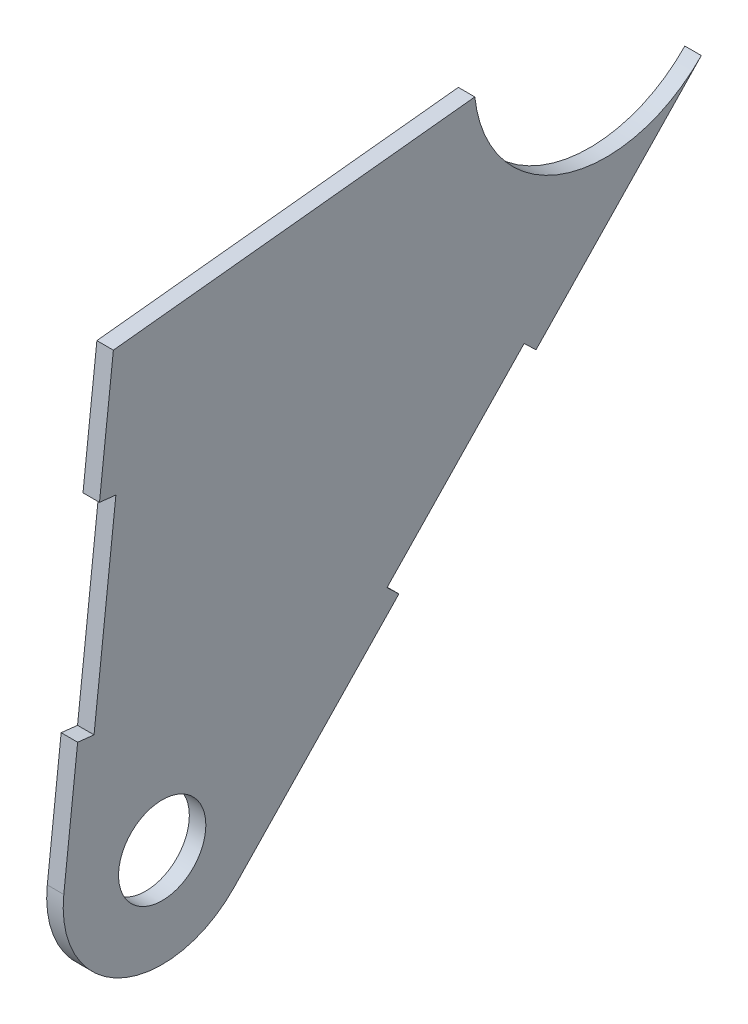
ISO-10303-21;
HEADER;
FILE_DESCRIPTION(('STEP AP214'),'2;1');
FILE_NAME('part.step','',(''),(''),'','','');
FILE_SCHEMA(('AUTOMOTIVE_DESIGN { 1 0 10303 214 1 1 1 1 }'));
ENDSEC;
DATA;
#1=APPLICATION_CONTEXT('core data for automotive mechanical design processes');
#2=APPLICATION_PROTOCOL_DEFINITION('international standard','automotive_design',2000,#1);
#3=PRODUCT_CONTEXT('',#1,'mechanical');
#4=PRODUCT('Part','Part','',(#3));
#5=PRODUCT_RELATED_PRODUCT_CATEGORY('part','',(#4));
#6=PRODUCT_DEFINITION_FORMATION('','',#4);
#7=PRODUCT_DEFINITION_CONTEXT('part definition',#1,'design');
#8=PRODUCT_DEFINITION('design','',#6,#7);
#9=PRODUCT_DEFINITION_SHAPE('','',#8);
#10=(LENGTH_UNIT() NAMED_UNIT(*) SI_UNIT(.MILLI.,.METRE.));
#11=(NAMED_UNIT(*) PLANE_ANGLE_UNIT() SI_UNIT($,.RADIAN.));
#12=(NAMED_UNIT(*) SI_UNIT($,.STERADIAN.) SOLID_ANGLE_UNIT());
#13=UNCERTAINTY_MEASURE_WITH_UNIT(LENGTH_MEASURE(1.E-05),#10,'distance_accuracy_value','');
#14=(GEOMETRIC_REPRESENTATION_CONTEXT(3) GLOBAL_UNCERTAINTY_ASSIGNED_CONTEXT((#13)) GLOBAL_UNIT_ASSIGNED_CONTEXT((#10,
#11,#12)) REPRESENTATION_CONTEXT('',''));
#15=CARTESIAN_POINT('',(0.,0.,0.));
#16=DIRECTION('',(0.,0.,1.));
#17=DIRECTION('',(1.,0.,0.));
#18=AXIS2_PLACEMENT_3D('',#15,#16,#17);
#19=CARTESIAN_POINT('',(1.5875,-6.59599350707376,-6.87157148363026));
#20=DIRECTION('',(0.,-0.692492756648165,-0.721424827677718));
#21=DIRECTION('',(0.,0.721424827677718,-0.692492756648165));
#22=AXIS2_PLACEMENT_3D('',#19,#20,#21);
#23=PLANE('',#22);
#24=DIRECTION('',(0.,-0.721424827677718,0.692492756648165));
#25=VECTOR('',#24,1.);
#26=CARTESIAN_POINT('',(0.,-6.59599350707376,-6.87157148363026));
#27=LINE('',#26,#25);
#28=CARTESIAN_POINT('',(0.,40.2816904225398,-51.8692695448362));
#29=VERTEX_POINT('',#28);
#30=CARTESIAN_POINT('',(0.,23.7144199413633,-35.966414021307));
#31=VERTEX_POINT('',#30);
#32=EDGE_CURVE('E195',#29,#31,#27,.T.);
#33=ORIENTED_EDGE('',*,*,#32,.F.);
#34=DIRECTION('',(-1.,0.,0.));
#35=VECTOR('',#34,1.);
#36=CARTESIAN_POINT('',(1.5875,40.2816904225398,-51.8692695448362));
#37=LINE('',#36,#35);
#38=CARTESIAN_POINT('',(1.5875,40.2816904225398,-51.8692695448362));
#39=VERTEX_POINT('',#38);
#40=EDGE_CURVE('E11',#39,#29,#37,.T.);
#41=ORIENTED_EDGE('',*,*,#40,.F.);
#42=DIRECTION('',(0.,-0.721424827677718,0.692492756648165));
#43=VECTOR('',#42,1.);
#44=CARTESIAN_POINT('',(1.5875,-6.59599350707376,-6.87157148363026));
#45=LINE('',#44,#43);
#46=CARTESIAN_POINT('',(1.5875,23.7144199413633,-35.966414021307));
#47=VERTEX_POINT('',#46);
#48=EDGE_CURVE('E243',#39,#47,#45,.T.);
#49=ORIENTED_EDGE('',*,*,#48,.T.);
#50=DIRECTION('',(-1.,0.,0.));
#51=VECTOR('',#50,1.);
#52=CARTESIAN_POINT('',(1.5875,23.7144199413633,-35.966414021307));
#53=LINE('',#52,#51);
#54=EDGE_CURVE('E60',#47,#31,#53,.T.);
#55=ORIENTED_EDGE('',*,*,#54,.T.);
#56=EDGE_LOOP('',(#33,#41,#49,#55));
#57=FACE_BOUND('',#56,.T.);
#58=ADVANCED_FACE('F40',(#57),#23,.T.);
#59=CARTESIAN_POINT('',(1.5875,49.0763484319715,-42.7071742333292));
#60=DIRECTION('',(-1.,0.,0.));
#61=DIRECTION('',(0.,0.,1.));
#62=AXIS2_PLACEMENT_3D('',#59,#60,#61);
#63=CYLINDRICAL_SURFACE('',#62,12.7);
#64=CARTESIAN_POINT('',(0.,49.0763484319715,-42.7071742333292));
#65=DIRECTION('',(1.,0.,0.));
#66=DIRECTION('',(0.,0.,-1.));
#67=AXIS2_PLACEMENT_3D('',#64,#65,#66);
#68=CIRCLE('',#67,12.7);
#69=CARTESIAN_POINT('',(0.,47.7288501739447,-30.0788628480087));
#70=VERTEX_POINT('',#69);
#71=EDGE_CURVE('E198',#29,#70,#68,.F.);
#72=ORIENTED_EDGE('',*,*,#71,.T.);
#73=DIRECTION('',(-1.,0.,0.));
#74=VECTOR('',#73,1.);
#75=CARTESIAN_POINT('',(1.5875,47.7288501739447,-30.0788628480087));
#76=LINE('',#75,#74);
#77=CARTESIAN_POINT('',(1.5875,47.7288501739447,-30.0788628480087));
#78=VERTEX_POINT('',#77);
#79=EDGE_CURVE('E49',#78,#70,#76,.T.);
#80=ORIENTED_EDGE('',*,*,#79,.F.);
#81=CARTESIAN_POINT('',(1.5875,49.0763484319715,-42.7071742333292));
#82=DIRECTION('',(1.,0.,0.));
#83=DIRECTION('',(0.,0.,-1.));
#84=AXIS2_PLACEMENT_3D('',#81,#82,#83);
#85=CIRCLE('',#84,12.7);
#86=EDGE_CURVE('E292',#39,#78,#85,.F.);
#87=ORIENTED_EDGE('',*,*,#86,.F.);
#88=ORIENTED_EDGE('',*,*,#40,.T.);
#89=EDGE_LOOP('',(#72,#80,#87,#88));
#90=FACE_BOUND('',#89,.T.);
#91=ADVANCED_FACE('F281',(#90),#63,.F.);
#92=CARTESIAN_POINT('',(1.5875,44.0181145954103,4.69693302050574));
#93=DIRECTION('',(0.,0.994355227190588,0.106102225041482));
#94=DIRECTION('',(0.,-0.106102225041482,0.994355227190588));
#95=AXIS2_PLACEMENT_3D('',#92,#93,#94);
#96=PLANE('',#95);
#97=DIRECTION('',(0.,0.106102225041482,-0.994355227190588));
#98=VECTOR('',#97,1.);
#99=CARTESIAN_POINT('',(0.,44.0181145954103,4.69693302050574));
#100=LINE('',#99,#98);
#101=CARTESIAN_POINT('',(0.,44.0181145954103,4.69693302050577));
#102=VERTEX_POINT('',#101);
#103=EDGE_CURVE('E203',#102,#70,#100,.T.);
#104=ORIENTED_EDGE('',*,*,#103,.F.);
#105=DIRECTION('',(-1.,0.,0.));
#106=VECTOR('',#105,1.);
#107=CARTESIAN_POINT('',(1.5875,44.0181145954103,4.69693302050577));
#108=LINE('',#107,#106);
#109=CARTESIAN_POINT('',(1.5875,44.0181145954103,4.69693302050577));
#110=VERTEX_POINT('',#109);
#111=EDGE_CURVE('E268',#110,#102,#108,.T.);
#112=ORIENTED_EDGE('',*,*,#111,.F.);
#113=DIRECTION('',(0.,0.106102225041482,-0.994355227190588));
#114=VECTOR('',#113,1.);
#115=CARTESIAN_POINT('',(1.5875,44.0181145954103,4.69693302050574));
#116=LINE('',#115,#114);
#117=EDGE_CURVE('E278',#110,#78,#116,.T.);
#118=ORIENTED_EDGE('',*,*,#117,.T.);
#119=ORIENTED_EDGE('',*,*,#79,.T.);
#120=EDGE_LOOP('',(#104,#112,#118,#119));
#121=FACE_BOUND('',#120,.T.);
#122=ADVANCED_FACE('F276',(#121),#96,.T.);
#123=CARTESIAN_POINT('',(1.5875,1.05094211034474,9.46684454719225));
#124=DIRECTION('',(0.,0.110335129694986,0.993894440650108));
#125=DIRECTION('',(0.,-0.993894440650108,0.110335129694986));
#126=AXIS2_PLACEMENT_3D('',#123,#124,#125);
#127=PLANE('',#126);
#128=DIRECTION('',(0.,0.993894440650108,-0.110335129694986));
#129=VECTOR('',#128,1.);
#130=CARTESIAN_POINT('',(0.,1.05094211034474,9.46684454719225));
#131=LINE('',#130,#129);
#132=CARTESIAN_POINT('',(0.,32.0013729000698,6.03094667350427));
#133=VERTEX_POINT('',#132);
#134=EDGE_CURVE('E207',#133,#102,#131,.T.);
#135=ORIENTED_EDGE('',*,*,#134,.F.);
#136=DIRECTION('',(-1.,0.,0.));
#137=VECTOR('',#136,1.);
#138=CARTESIAN_POINT('',(1.5875,32.0013729000698,6.03094667350427));
#139=LINE('',#138,#137);
#140=CARTESIAN_POINT('',(1.5875,32.0013729000698,6.03094667350427));
#141=VERTEX_POINT('',#140);
#142=EDGE_CURVE('E265',#141,#133,#139,.T.);
#143=ORIENTED_EDGE('',*,*,#142,.F.);
#144=DIRECTION('',(0.,0.993894440650108,-0.110335129694986));
#145=VECTOR('',#144,1.);
#146=CARTESIAN_POINT('',(1.5875,1.05094211034474,9.46684454719225));
#147=LINE('',#146,#145);
#148=EDGE_CURVE('E291',#141,#110,#147,.T.);
#149=ORIENTED_EDGE('',*,*,#148,.T.);
#150=ORIENTED_EDGE('',*,*,#111,.T.);
#151=EDGE_LOOP('',(#135,#143,#149,#150));
#152=FACE_BOUND('',#151,.T.);
#153=ADVANCED_FACE('F287',(#152),#127,.T.);
#154=CARTESIAN_POINT('',(1.5875,30.9504307897251,-3.43589787368799));
#155=DIRECTION('',(0.,0.993894440650108,-0.110335129694986));
#156=DIRECTION('',(0.,0.110335129694986,0.993894440650108));
#157=AXIS2_PLACEMENT_3D('',#154,#155,#156);
#158=PLANE('',#157);
#159=DIRECTION('',(0.,-0.110335129694986,-0.993894440650108));
#160=VECTOR('',#159,1.);
#161=CARTESIAN_POINT('',(0.,30.9504307897251,-3.43589787368799));
#162=LINE('',#161,#160);
#163=CARTESIAN_POINT('',(0.,31.826215881679,4.45313924897222));
#164=VERTEX_POINT('',#163);
#165=EDGE_CURVE('E211',#133,#164,#162,.T.);
#166=ORIENTED_EDGE('',*,*,#165,.T.);
#167=DIRECTION('',(-1.,0.,0.));
#168=VECTOR('',#167,1.);
#169=CARTESIAN_POINT('',(1.5875,31.826215881679,4.45313924897222));
#170=LINE('',#169,#168);
#171=CARTESIAN_POINT('',(1.5875,31.826215881679,4.45313924897222));
#172=VERTEX_POINT('',#171);
#173=EDGE_CURVE('E262',#172,#164,#170,.T.);
#174=ORIENTED_EDGE('',*,*,#173,.F.);
#175=DIRECTION('',(0.,-0.110335129694986,-0.993894440650108));
#176=VECTOR('',#175,1.);
#177=CARTESIAN_POINT('',(1.5875,30.9504307897251,-3.43589787368799));
#178=LINE('',#177,#176);
#179=EDGE_CURVE('E296',#141,#172,#178,.T.);
#180=ORIENTED_EDGE('',*,*,#179,.F.);
#181=ORIENTED_EDGE('',*,*,#142,.T.);
#182=EDGE_LOOP('',(#166,#174,#180,#181));
#183=FACE_BOUND('',#182,.T.);
#184=ADVANCED_FACE('F345',(#183),#158,.F.);
#185=CARTESIAN_POINT('',(1.5875,0.875785091953967,7.88903712266025));
#186=DIRECTION('',(0.,0.110335129694988,0.993894440650108));
#187=DIRECTION('',(0.,-0.993894440650108,0.110335129694988));
#188=AXIS2_PLACEMENT_3D('',#185,#186,#187);
#189=PLANE('',#188);
#190=DIRECTION('',(0.,0.993894440650108,-0.110335129694988));
#191=VECTOR('',#190,1.);
#192=CARTESIAN_POINT('',(0.,0.875785091953967,7.88903712266025));
#193=LINE('',#192,#191);
#194=CARTESIAN_POINT('',(0.,12.8925267872945,6.55502346966174));
#195=VERTEX_POINT('',#194);
#196=EDGE_CURVE('E215',#195,#164,#193,.T.);
#197=ORIENTED_EDGE('',*,*,#196,.F.);
#198=DIRECTION('',(-1.,0.,0.));
#199=VECTOR('',#198,1.);
#200=CARTESIAN_POINT('',(1.5875,12.8925267872945,6.55502346966174));
#201=LINE('',#200,#199);
#202=CARTESIAN_POINT('',(1.5875,12.8925267872945,6.55502346966174));
#203=VERTEX_POINT('',#202);
#204=EDGE_CURVE('E259',#203,#195,#201,.T.);
#205=ORIENTED_EDGE('',*,*,#204,.F.);
#206=DIRECTION('',(0.,0.993894440650108,-0.110335129694988));
#207=VECTOR('',#206,1.);
#208=CARTESIAN_POINT('',(1.5875,0.875785091953967,7.88903712266025));
#209=LINE('',#208,#207);
#210=EDGE_CURVE('E303',#203,#172,#209,.T.);
#211=ORIENTED_EDGE('',*,*,#210,.T.);
#212=ORIENTED_EDGE('',*,*,#173,.T.);
#213=EDGE_LOOP('',(#197,#205,#211,#212));
#214=FACE_BOUND('',#213,.T.);
#215=ADVANCED_FACE('F348',(#214),#189,.T.);
#216=CARTESIAN_POINT('',(1.5875,12.0167416953405,-1.33401365299849));
#217=DIRECTION('',(0.,0.993894440650108,-0.110335129694985));
#218=DIRECTION('',(0.,0.110335129694985,0.993894440650108));
#219=AXIS2_PLACEMENT_3D('',#216,#217,#218);
#220=PLANE('',#219);
#221=DIRECTION('',(0.,-0.110335129694985,-0.993894440650108));
#222=VECTOR('',#221,1.);
#223=CARTESIAN_POINT('',(0.,12.0167416953405,-1.33401365299849));
#224=LINE('',#223,#222);
#225=CARTESIAN_POINT('',(0.,13.0676838056853,8.13283089419378));
#226=VERTEX_POINT('',#225);
#227=EDGE_CURVE('E219',#226,#195,#224,.T.);
#228=ORIENTED_EDGE('',*,*,#227,.F.);
#229=DIRECTION('',(-1.,0.,0.));
#230=VECTOR('',#229,1.);
#231=CARTESIAN_POINT('',(1.5875,13.0676838056853,8.13283089419378));
#232=LINE('',#231,#230);
#233=CARTESIAN_POINT('',(1.5875,13.0676838056853,8.13283089419378));
#234=VERTEX_POINT('',#233);
#235=EDGE_CURVE('E256',#234,#226,#232,.T.);
#236=ORIENTED_EDGE('',*,*,#235,.F.);
#237=DIRECTION('',(0.,-0.110335129694985,-0.993894440650108));
#238=VECTOR('',#237,1.);
#239=CARTESIAN_POINT('',(1.5875,12.0167416953405,-1.33401365299849));
#240=LINE('',#239,#238);
#241=EDGE_CURVE('E307',#234,#203,#240,.T.);
#242=ORIENTED_EDGE('',*,*,#241,.T.);
#243=ORIENTED_EDGE('',*,*,#204,.T.);
#244=EDGE_LOOP('',(#228,#236,#242,#243));
#245=FACE_BOUND('',#244,.T.);
#246=ADVANCED_FACE('F352',(#245),#220,.T.);
#247=CARTESIAN_POINT('',(1.5875,1.05094211034474,9.46684454719228));
#248=DIRECTION('',(0.,0.110335129694986,0.993894440650108));
#249=DIRECTION('',(0.,-0.993894440650108,0.110335129694986));
#250=AXIS2_PLACEMENT_3D('',#247,#248,#249);
#251=PLANE('',#250);
#252=DIRECTION('',(0.,0.993894440650108,-0.110335129694986));
#253=VECTOR('',#252,1.);
#254=CARTESIAN_POINT('',(0.,1.05094211034474,9.46684454719228));
#255=LINE('',#254,#253);
#256=CARTESIAN_POINT('',(0.,1.05094211034475,9.46684454719228));
#257=VERTEX_POINT('',#256);
#258=EDGE_CURVE('E223',#257,#226,#255,.T.);
#259=ORIENTED_EDGE('',*,*,#258,.F.);
#260=DIRECTION('',(-1.,0.,0.));
#261=VECTOR('',#260,1.);
#262=CARTESIAN_POINT('',(1.5875,1.05094211034475,9.46684454719228));
#263=LINE('',#262,#261);
#264=CARTESIAN_POINT('',(1.5875,1.05094211034475,9.46684454719228));
#265=VERTEX_POINT('',#264);
#266=EDGE_CURVE('E253',#265,#257,#263,.T.);
#267=ORIENTED_EDGE('',*,*,#266,.F.);
#268=DIRECTION('',(0.,0.993894440650108,-0.110335129694986));
#269=VECTOR('',#268,1.);
#270=CARTESIAN_POINT('',(1.5875,1.05094211034474,9.46684454719228));
#271=LINE('',#270,#269);
#272=EDGE_CURVE('E311',#265,#234,#271,.T.);
#273=ORIENTED_EDGE('',*,*,#272,.T.);
#274=ORIENTED_EDGE('',*,*,#235,.T.);
#275=EDGE_LOOP('',(#259,#267,#273,#274));
#276=FACE_BOUND('',#275,.T.);
#277=ADVANCED_FACE('F356',(#276),#251,.T.);
#278=CARTESIAN_POINT('',(1.5875,0.,0.));
#279=DIRECTION('',(-1.,0.,0.));
#280=DIRECTION('',(0.,0.,1.));
#281=AXIS2_PLACEMENT_3D('',#278,#279,#280);
#282=CYLINDRICAL_SURFACE('',#281,9.525);
#283=CARTESIAN_POINT('',(0.,0.,0.));
#284=DIRECTION('',(1.,0.,0.));
#285=DIRECTION('',(0.,0.,-1.));
#286=AXIS2_PLACEMENT_3D('',#283,#284,#285);
#287=CIRCLE('',#286,9.525);
#288=CARTESIAN_POINT('',(0.,-6.59599350707377,-6.87157148363027));
#289=VERTEX_POINT('',#288);
#290=EDGE_CURVE('E227',#257,#289,#287,.T.);
#291=ORIENTED_EDGE('',*,*,#290,.T.);
#292=DIRECTION('',(-1.,0.,0.));
#293=VECTOR('',#292,1.);
#294=CARTESIAN_POINT('',(1.5875,-6.59599350707377,-6.87157148363027));
#295=LINE('',#294,#293);
#296=CARTESIAN_POINT('',(1.5875,-6.59599350707377,-6.87157148363027));
#297=VERTEX_POINT('',#296);
#298=EDGE_CURVE('E250',#297,#289,#295,.T.);
#299=ORIENTED_EDGE('',*,*,#298,.F.);
#300=CARTESIAN_POINT('',(1.5875,0.,0.));
#301=DIRECTION('',(1.,0.,0.));
#302=DIRECTION('',(0.,0.,-1.));
#303=AXIS2_PLACEMENT_3D('',#300,#301,#302);
#304=CIRCLE('',#303,9.525);
#305=EDGE_CURVE('E315',#265,#297,#304,.T.);
#306=ORIENTED_EDGE('',*,*,#305,.F.);
#307=ORIENTED_EDGE('',*,*,#266,.T.);
#308=EDGE_LOOP('',(#291,#299,#306,#307));
#309=FACE_BOUND('',#308,.T.);
#310=ADVANCED_FACE('F360',(#309),#282,.T.);
#311=CARTESIAN_POINT('',(1.5875,-6.59599350707377,-6.87157148363027));
#312=DIRECTION('',(0.,-0.692492756648164,-0.721424827677719));
#313=DIRECTION('',(0.,0.721424827677719,-0.692492756648164));
#314=AXIS2_PLACEMENT_3D('',#311,#312,#313);
#315=PLANE('',#314);
#316=DIRECTION('',(0.,-0.721424827677719,0.692492756648164));
#317=VECTOR('',#316,1.);
#318=CARTESIAN_POINT('',(0.,-6.59599350707377,-6.87157148363027));
#319=LINE('',#318,#317);
#320=CARTESIAN_POINT('',(0.,9.97127697410277,-22.7744270071595));
#321=VERTEX_POINT('',#320);
#322=EDGE_CURVE('E231',#321,#289,#319,.T.);
#323=ORIENTED_EDGE('',*,*,#322,.F.);
#324=DIRECTION('',(-1.,0.,0.));
#325=VECTOR('',#324,1.);
#326=CARTESIAN_POINT('',(1.5875,9.97127697410277,-22.7744270071595));
#327=LINE('',#326,#325);
#328=CARTESIAN_POINT('',(1.5875,9.97127697410277,-22.7744270071595));
#329=VERTEX_POINT('',#328);
#330=EDGE_CURVE('E184',#329,#321,#327,.T.);
#331=ORIENTED_EDGE('',*,*,#330,.F.);
#332=DIRECTION('',(0.,-0.721424827677719,0.692492756648164));
#333=VECTOR('',#332,1.);
#334=CARTESIAN_POINT('',(1.5875,-6.59599350707377,-6.87157148363027));
#335=LINE('',#334,#333);
#336=EDGE_CURVE('E172',#329,#297,#335,.T.);
#337=ORIENTED_EDGE('',*,*,#336,.T.);
#338=ORIENTED_EDGE('',*,*,#298,.T.);
#339=EDGE_LOOP('',(#323,#331,#337,#338));
#340=FACE_BOUND('',#339,.T.);
#341=ADVANCED_FACE('F320',(#340),#315,.T.);
#342=CARTESIAN_POINT('',(1.5875,16.5672704811765,-15.9028555235292));
#343=DIRECTION('',(0.,-0.721424827677718,0.692492756648165));
#344=DIRECTION('',(0.,-0.692492756648165,-0.721424827677718));
#345=AXIS2_PLACEMENT_3D('',#342,#343,#344);
#346=PLANE('',#345);
#347=DIRECTION('',(0.,0.692492756648165,0.721424827677718));
#348=VECTOR('',#347,1.);
#349=CARTESIAN_POINT('',(0.,16.5672704811765,-15.9028555235292));
#350=LINE('',#349,#348);
#351=CARTESIAN_POINT('',(0.,11.0706092252817,-21.6291650932211));
#352=VERTEX_POINT('',#351);
#353=EDGE_CURVE('E180',#321,#352,#350,.T.);
#354=ORIENTED_EDGE('',*,*,#353,.T.);
#355=DIRECTION('',(-1.,0.,0.));
#356=VECTOR('',#355,1.);
#357=CARTESIAN_POINT('',(1.5875,11.0706092252817,-21.6291650932211));
#358=LINE('',#357,#356);
#359=CARTESIAN_POINT('',(1.5875,11.0706092252817,-21.6291650932211));
#360=VERTEX_POINT('',#359);
#361=EDGE_CURVE('E177',#360,#352,#358,.T.);
#362=ORIENTED_EDGE('',*,*,#361,.F.);
#363=DIRECTION('',(0.,0.692492756648165,0.721424827677718));
#364=VECTOR('',#363,1.);
#365=CARTESIAN_POINT('',(1.5875,16.5672704811765,-15.9028555235292));
#366=LINE('',#365,#364);
#367=EDGE_CURVE('E164',#329,#360,#366,.T.);
#368=ORIENTED_EDGE('',*,*,#367,.F.);
#369=ORIENTED_EDGE('',*,*,#330,.T.);
#370=EDGE_LOOP('',(#354,#362,#368,#369));
#371=FACE_BOUND('',#370,.T.);
#372=ADVANCED_FACE('F178',(#371),#346,.F.);
#373=CARTESIAN_POINT('',(1.5875,-5.49666125589481,-5.7263095696919));
#374=DIRECTION('',(0.,0.692492756648164,0.721424827677719));
#375=DIRECTION('',(0.,-0.721424827677719,0.692492756648165));
#376=AXIS2_PLACEMENT_3D('',#373,#374,#375);
#377=PLANE('',#376);
#378=DIRECTION('',(0.,0.721424827677719,-0.692492756648165));
#379=VECTOR('',#378,1.);
#380=CARTESIAN_POINT('',(0.,-5.49666125589481,-5.7263095696919));
#381=LINE('',#380,#379);
#382=CARTESIAN_POINT('',(0.,24.8137521925423,-34.8211521073686));
#383=VERTEX_POINT('',#382);
#384=EDGE_CURVE('E236',#352,#383,#381,.T.);
#385=ORIENTED_EDGE('',*,*,#384,.T.);
#386=DIRECTION('',(-1.,0.,0.));
#387=VECTOR('',#386,1.);
#388=CARTESIAN_POINT('',(1.5875,24.8137521925423,-34.8211521073686));
#389=LINE('',#388,#387);
#390=CARTESIAN_POINT('',(1.5875,24.8137521925423,-34.8211521073686));
#391=VERTEX_POINT('',#390);
#392=EDGE_CURVE('E113',#391,#383,#389,.T.);
#393=ORIENTED_EDGE('',*,*,#392,.F.);
#394=DIRECTION('',(0.,0.721424827677719,-0.692492756648165));
#395=VECTOR('',#394,1.);
#396=CARTESIAN_POINT('',(1.5875,-5.49666125589481,-5.7263095696919));
#397=LINE('',#396,#395);
#398=EDGE_CURVE('E170',#360,#391,#397,.T.);
#399=ORIENTED_EDGE('',*,*,#398,.F.);
#400=ORIENTED_EDGE('',*,*,#361,.T.);
#401=EDGE_LOOP('',(#385,#393,#399,#400));
#402=FACE_BOUND('',#401,.T.);
#403=ADVANCED_FACE('F186',(#402),#377,.F.);
#404=CARTESIAN_POINT('',(1.5875,30.3104134484371,-29.0948425376766));
#405=DIRECTION('',(0.,-0.721424827677721,0.692492756648162));
#406=DIRECTION('',(0.,-0.692492756648162,-0.721424827677721));
#407=AXIS2_PLACEMENT_3D('',#404,#405,#406);
#408=PLANE('',#407);
#409=DIRECTION('',(0.,0.692492756648162,0.721424827677721));
#410=VECTOR('',#409,1.);
#411=CARTESIAN_POINT('',(0.,30.3104134484371,-29.0948425376766));
#412=LINE('',#411,#410);
#413=EDGE_CURVE('E239',#31,#383,#412,.T.);
#414=ORIENTED_EDGE('',*,*,#413,.F.);
#415=ORIENTED_EDGE('',*,*,#54,.F.);
#416=DIRECTION('',(0.,0.692492756648162,0.721424827677721));
#417=VECTOR('',#416,1.);
#418=CARTESIAN_POINT('',(1.5875,30.3104134484371,-29.0948425376766));
#419=LINE('',#418,#417);
#420=EDGE_CURVE('E188',#47,#391,#419,.T.);
#421=ORIENTED_EDGE('',*,*,#420,.T.);
#422=ORIENTED_EDGE('',*,*,#392,.T.);
#423=EDGE_LOOP('',(#414,#415,#421,#422));
#424=FACE_BOUND('',#423,.T.);
#425=ADVANCED_FACE('F323',(#424),#408,.T.);
#426=CARTESIAN_POINT('',(1.5875,0.,0.));
#427=DIRECTION('',(1.,0.,0.));
#428=DIRECTION('',(0.,0.,-1.));
#429=AXIS2_PLACEMENT_3D('',#426,#427,#428);
#430=PLANE('',#429);
#431=CARTESIAN_POINT('',(1.5875,0.,0.));
#432=DIRECTION('',(1.,0.,0.));
#433=DIRECTION('',(0.,0.,-1.));
#434=AXIS2_PLACEMENT_3D('',#431,#432,#433);
#435=CIRCLE('',#434,4.19999999999999);
#436=CARTESIAN_POINT('',(1.5875,0.,-4.19999999999999));
#437=VERTEX_POINT('',#436);
#438=EDGE_CURVE('E419',#437,#437,#435,.T.);
#439=ORIENTED_EDGE('',*,*,#438,.F.);
#440=EDGE_LOOP('',(#439));
#441=FACE_BOUND('',#440,.T.);
#442=ORIENTED_EDGE('',*,*,#48,.F.);
#443=ORIENTED_EDGE('',*,*,#86,.T.);
#444=ORIENTED_EDGE('',*,*,#117,.F.);
#445=ORIENTED_EDGE('',*,*,#148,.F.);
#446=ORIENTED_EDGE('',*,*,#179,.T.);
#447=ORIENTED_EDGE('',*,*,#210,.F.);
#448=ORIENTED_EDGE('',*,*,#241,.F.);
#449=ORIENTED_EDGE('',*,*,#272,.F.);
#450=ORIENTED_EDGE('',*,*,#305,.T.);
#451=ORIENTED_EDGE('',*,*,#336,.F.);
#452=ORIENTED_EDGE('',*,*,#367,.T.);
#453=ORIENTED_EDGE('',*,*,#398,.T.);
#454=ORIENTED_EDGE('',*,*,#420,.F.);
#455=EDGE_LOOP('',(#442,#443,#444,#445,#446,#447,#448,#449,#450,#451,#452,#453,#454));
#456=FACE_BOUND('',#455,.T.);
#457=ADVANCED_FACE('F167',(#441,#456),#430,.T.);
#458=CARTESIAN_POINT('',(0.,0.,0.));
#459=DIRECTION('',(1.,0.,0.));
#460=DIRECTION('',(0.,0.,-1.));
#461=AXIS2_PLACEMENT_3D('',#458,#459,#460);
#462=PLANE('',#461);
#463=CARTESIAN_POINT('',(0.,0.,0.));
#464=DIRECTION('',(1.,0.,0.));
#465=DIRECTION('',(0.,0.,-1.));
#466=AXIS2_PLACEMENT_3D('',#463,#464,#465);
#467=CIRCLE('',#466,4.2);
#468=CARTESIAN_POINT('',(0.,0.,-4.2));
#469=VERTEX_POINT('',#468);
#470=EDGE_CURVE('E199',#469,#469,#467,.T.);
#471=ORIENTED_EDGE('',*,*,#470,.T.);
#472=EDGE_LOOP('',(#471));
#473=FACE_BOUND('',#472,.T.);
#474=ORIENTED_EDGE('',*,*,#32,.T.);
#475=ORIENTED_EDGE('',*,*,#413,.T.);
#476=ORIENTED_EDGE('',*,*,#384,.F.);
#477=ORIENTED_EDGE('',*,*,#353,.F.);
#478=ORIENTED_EDGE('',*,*,#322,.T.);
#479=ORIENTED_EDGE('',*,*,#290,.F.);
#480=ORIENTED_EDGE('',*,*,#258,.T.);
#481=ORIENTED_EDGE('',*,*,#227,.T.);
#482=ORIENTED_EDGE('',*,*,#196,.T.);
#483=ORIENTED_EDGE('',*,*,#165,.F.);
#484=ORIENTED_EDGE('',*,*,#134,.T.);
#485=ORIENTED_EDGE('',*,*,#103,.T.);
#486=ORIENTED_EDGE('',*,*,#71,.F.);
#487=EDGE_LOOP('',(#474,#475,#476,#477,#478,#479,#480,#481,#482,#483,#484,#485,#486));
#488=FACE_BOUND('',#487,.T.);
#489=ADVANCED_FACE('F283',(#473,#488),#462,.F.);
#490=CARTESIAN_POINT('',(1.5875,0.,0.));
#491=DIRECTION('',(1.,0.,0.));
#492=DIRECTION('',(0.,0.,-1.));
#493=AXIS2_PLACEMENT_3D('',#490,#491,#492);
#494=CYLINDRICAL_SURFACE('',#493,4.19999999999999);
#495=ORIENTED_EDGE('',*,*,#470,.F.);
#496=EDGE_LOOP('',(#495));
#497=FACE_BOUND('',#496,.T.);
#498=ORIENTED_EDGE('',*,*,#438,.T.);
#499=EDGE_LOOP('',(#498));
#500=FACE_BOUND('',#499,.T.);
#501=ADVANCED_FACE('F400',(#497,#500),#494,.F.);
#502=CLOSED_SHELL('',(#58,#91,#122,#153,#184,#215,#246,#277,#310,#341,#372,#403,#425,#457,#489,#501));
#503=MANIFOLD_SOLID_BREP('B2',#502);
#504=ADVANCED_BREP_SHAPE_REPRESENTATION('',(#18,#503),#14);
#505=SHAPE_DEFINITION_REPRESENTATION(#9,#504);
ENDSEC;
END-ISO-10303-21;
